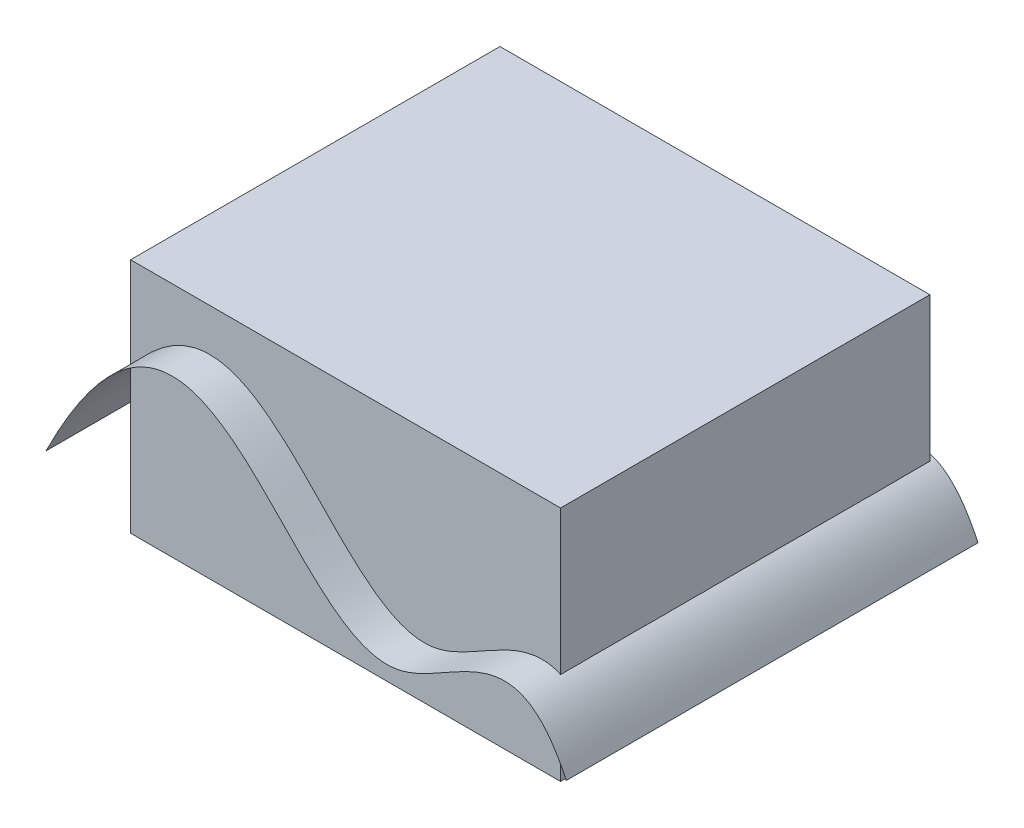
ISO-10303-21;
HEADER;
FILE_DESCRIPTION(('STEP AP214'),'2;1');
FILE_NAME('part.step','',(''),(''),'','','');
FILE_SCHEMA(('AUTOMOTIVE_DESIGN { 1 0 10303 214 1 1 1 1 }'));
ENDSEC;
DATA;
#1=APPLICATION_CONTEXT('core data for automotive mechanical design processes');
#2=APPLICATION_PROTOCOL_DEFINITION('international standard','automotive_design',2000,#1);
#3=PRODUCT_CONTEXT('',#1,'mechanical');
#4=PRODUCT('Part','Part','',(#3));
#5=PRODUCT_RELATED_PRODUCT_CATEGORY('part','',(#4));
#6=PRODUCT_DEFINITION_FORMATION('','',#4);
#7=PRODUCT_DEFINITION_CONTEXT('part definition',#1,'design');
#8=PRODUCT_DEFINITION('design','',#6,#7);
#9=PRODUCT_DEFINITION_SHAPE('','',#8);
#10=(LENGTH_UNIT() NAMED_UNIT(*) SI_UNIT(.MILLI.,.METRE.));
#11=(NAMED_UNIT(*) PLANE_ANGLE_UNIT() SI_UNIT($,.RADIAN.));
#12=(NAMED_UNIT(*) SI_UNIT($,.STERADIAN.) SOLID_ANGLE_UNIT());
#13=UNCERTAINTY_MEASURE_WITH_UNIT(LENGTH_MEASURE(1.E-05),#10,'distance_accuracy_value','');
#14=(GEOMETRIC_REPRESENTATION_CONTEXT(3) GLOBAL_UNCERTAINTY_ASSIGNED_CONTEXT((#13)) GLOBAL_UNIT_ASSIGNED_CONTEXT((#10,
#11,#12)) REPRESENTATION_CONTEXT('',''));
#15=CARTESIAN_POINT('',(0.,0.,0.));
#16=DIRECTION('',(0.,0.,1.));
#17=DIRECTION('',(1.,0.,0.));
#18=AXIS2_PLACEMENT_3D('',#15,#16,#17);
#19=CARTESIAN_POINT('',(-88.9503624856376,22.5454685632026,62.6633162704457));
#20=CARTESIAN_POINT('',(-37.8141386567155,125.215292475116,62.6633162704457));
#21=CARTESIAN_POINT('',(5.84947542840995,-43.7179988687432,62.6633162704457));
#22=CARTESIAN_POINT('',(69.6437169043807,52.4820397279148,62.6633162704457));
#23=CARTESIAN_POINT('',(87.5841174456941,13.9727510125804,62.6633162704457));
#24=B_SPLINE_CURVE_WITH_KNOTS('',3,(#19,#20,#21,#22,#23),.UNSPECIFIED.,.F.,.F.,(4,1,4),(0.,
0.6650166527823,1.),.UNSPECIFIED.);
#25=DIRECTION('',(0.,0.,-1.));
#26=VECTOR('',#25,1.);
#27=SURFACE_OF_LINEAR_EXTRUSION('',#24,#26);
#28=CARTESIAN_POINT('',(-88.9503624856376,22.5454685632026,-64.3366837295543));
#29=CARTESIAN_POINT('',(-37.8141386567155,125.215292475116,-64.3366837295543));
#30=CARTESIAN_POINT('',(5.84947542840995,-43.7179988687432,-64.3366837295543));
#31=CARTESIAN_POINT('',(69.6437169043807,52.4820397279148,-64.3366837295543));
#32=CARTESIAN_POINT('',(87.5841174456941,13.9727510125804,-64.3366837295543));
#33=B_SPLINE_CURVE_WITH_KNOTS('',3,(#28,#29,#30,#31,#32),.UNSPECIFIED.,.F.,.F.,(4,1,4),(0.,
0.6650166527823,1.),.UNSPECIFIED.);
#34=CARTESIAN_POINT('',(-88.9503624856376,22.5454685632026,-64.3366837295543));
#35=VERTEX_POINT('',#34);
#36=CARTESIAN_POINT('',(87.5841174456941,13.9727510125804,-64.3366837295543));
#37=VERTEX_POINT('',#36);
#38=EDGE_CURVE('E55',#35,#37,#33,.T.);
#39=ORIENTED_EDGE('',*,*,#38,.F.);
#40=DIRECTION('',(0.,0.,-1.));
#41=VECTOR('',#40,1.);
#42=CARTESIAN_POINT('',(-88.9503624856376,22.5454685632026,62.6633162704457));
#43=LINE('',#42,#41);
#44=CARTESIAN_POINT('',(-88.9503624856376,22.5454685632026,75.3633162704457));
#45=VERTEX_POINT('',#44);
#46=EDGE_CURVE('E47',#45,#35,#43,.T.);
#47=ORIENTED_EDGE('',*,*,#46,.F.);
#48=CARTESIAN_POINT('',(-88.9503624856376,22.5454685632026,75.3633162704457));
#49=CARTESIAN_POINT('',(-37.8141386567155,125.215292475116,75.3633162704457));
#50=CARTESIAN_POINT('',(5.84947542840995,-43.7179988687432,75.3633162704457));
#51=CARTESIAN_POINT('',(69.6437169043807,52.4820397279148,75.3633162704457));
#52=CARTESIAN_POINT('',(87.5841174456941,13.9727510125804,75.3633162704457));
#53=B_SPLINE_CURVE_WITH_KNOTS('',3,(#48,#49,#50,#51,#52),.UNSPECIFIED.,.F.,.F.,(4,1,4),(0.,
0.6650166527823,1.),.UNSPECIFIED.);
#54=CARTESIAN_POINT('',(87.5841174456941,13.9727510125804,75.3633162704457));
#55=VERTEX_POINT('',#54);
#56=EDGE_CURVE('E65',#45,#55,#53,.T.);
#57=ORIENTED_EDGE('',*,*,#56,.T.);
#58=DIRECTION('',(0.,0.,-1.));
#59=VECTOR('',#58,1.);
#60=CARTESIAN_POINT('',(87.5841174456941,13.9727510125804,62.6633162704457));
#61=LINE('',#60,#59);
#62=EDGE_CURVE('E12',#55,#37,#61,.T.);
#63=ORIENTED_EDGE('',*,*,#62,.T.);
#64=EDGE_LOOP('',(#39,#47,#57,#63));
#65=FACE_BOUND('',#64,.T.);
#66=ADVANCED_FACE('F45',(#65),#27,.T.);
#67=OPEN_SHELL('',(#66));
#68=SHELL_BASED_SURFACE_MODEL('B2',(#67));
#69=CARTESIAN_POINT('',(72.9401001387988,80.3747042919709,62.6633162704457));
#70=DIRECTION('',(-1.,0.,0.));
#71=DIRECTION('',(0.,0.,1.));
#72=AXIS2_PLACEMENT_3D('',#69,#70,#71);
#73=PLANE('',#72);
#74=DIRECTION('',(0.,0.,-1.));
#75=VECTOR('',#74,1.);
#76=CARTESIAN_POINT('',(72.9401001387988,0.,62.6633162704457));
#77=LINE('',#76,#75);
#78=CARTESIAN_POINT('',(72.9401001387988,0.,62.6633162704457));
#79=VERTEX_POINT('',#78);
#80=CARTESIAN_POINT('',(72.9401001387988,0.,-62.6633162704457));
#81=VERTEX_POINT('',#80);
#82=EDGE_CURVE('E169',#79,#81,#77,.T.);
#83=ORIENTED_EDGE('',*,*,#82,.T.);
#84=DIRECTION('',(0.,-1.,0.));
#85=VECTOR('',#84,1.);
#86=CARTESIAN_POINT('',(72.9401001387988,80.3747042919709,-62.6633162704457));
#87=LINE('',#86,#85);
#88=CARTESIAN_POINT('',(72.9401001387988,80.3747042919709,-62.6633162704457));
#89=VERTEX_POINT('',#88);
#90=EDGE_CURVE('E43',#89,#81,#87,.T.);
#91=ORIENTED_EDGE('',*,*,#90,.F.);
#92=DIRECTION('',(0.,0.,-1.));
#93=VECTOR('',#92,1.);
#94=CARTESIAN_POINT('',(72.9401001387988,80.3747042919709,62.6633162704457));
#95=LINE('',#94,#93);
#96=CARTESIAN_POINT('',(72.9401001387988,80.3747042919709,62.6633162704457));
#97=VERTEX_POINT('',#96);
#98=EDGE_CURVE('E157',#97,#89,#95,.T.);
#99=ORIENTED_EDGE('',*,*,#98,.F.);
#100=DIRECTION('',(0.,-1.,0.));
#101=VECTOR('',#100,1.);
#102=CARTESIAN_POINT('',(72.9401001387988,80.3747042919709,62.6633162704457));
#103=LINE('',#102,#101);
#104=EDGE_CURVE('E165',#97,#79,#103,.T.);
#105=ORIENTED_EDGE('',*,*,#104,.T.);
#106=EDGE_LOOP('',(#83,#91,#99,#105));
#107=FACE_BOUND('',#106,.T.);
#108=ADVANCED_FACE('F106',(#107),#73,.F.);
#109=CARTESIAN_POINT('',(-72.9401001387988,80.3747042919709,-62.6633162704457));
#110=DIRECTION('',(0.,0.,1.));
#111=DIRECTION('',(1.,0.,0.));
#112=AXIS2_PLACEMENT_3D('',#109,#110,#111);
#113=PLANE('',#112);
#114=DIRECTION('',(-1.,0.,0.));
#115=VECTOR('',#114,1.);
#116=CARTESIAN_POINT('',(-72.9401001387988,0.,-62.6633162704457));
#117=LINE('',#116,#115);
#118=CARTESIAN_POINT('',(-72.9401001387988,0.,-62.6633162704457));
#119=VERTEX_POINT('',#118);
#120=EDGE_CURVE('E161',#81,#119,#117,.T.);
#121=ORIENTED_EDGE('',*,*,#120,.T.);
#122=DIRECTION('',(0.,-1.,0.));
#123=VECTOR('',#122,1.);
#124=CARTESIAN_POINT('',(-72.9401001387988,80.3747042919709,-62.6633162704457));
#125=LINE('',#124,#123);
#126=CARTESIAN_POINT('',(-72.9401001387988,80.3747042919709,-62.6633162704457));
#127=VERTEX_POINT('',#126);
#128=EDGE_CURVE('E114',#127,#119,#125,.T.);
#129=ORIENTED_EDGE('',*,*,#128,.F.);
#130=DIRECTION('',(-1.,0.,0.));
#131=VECTOR('',#130,1.);
#132=CARTESIAN_POINT('',(-72.9401001387988,80.3747042919709,-62.6633162704457));
#133=LINE('',#132,#131);
#134=EDGE_CURVE('E152',#89,#127,#133,.T.);
#135=ORIENTED_EDGE('',*,*,#134,.F.);
#136=ORIENTED_EDGE('',*,*,#90,.T.);
#137=EDGE_LOOP('',(#121,#129,#135,#136));
#138=FACE_BOUND('',#137,.T.);
#139=ADVANCED_FACE('F160',(#138),#113,.F.);
#140=CARTESIAN_POINT('',(-72.9401001387988,80.3747042919709,62.6633162704457));
#141=DIRECTION('',(1.,0.,0.));
#142=DIRECTION('',(0.,0.,-1.));
#143=AXIS2_PLACEMENT_3D('',#140,#141,#142);
#144=PLANE('',#143);
#145=DIRECTION('',(0.,0.,1.));
#146=VECTOR('',#145,1.);
#147=CARTESIAN_POINT('',(-72.9401001387988,0.,62.6633162704457));
#148=LINE('',#147,#146);
#149=CARTESIAN_POINT('',(-72.9401001387988,0.,62.6633162704457));
#150=VERTEX_POINT('',#149);
#151=EDGE_CURVE('E139',#119,#150,#148,.T.);
#152=ORIENTED_EDGE('',*,*,#151,.T.);
#153=DIRECTION('',(0.,-1.,0.));
#154=VECTOR('',#153,1.);
#155=CARTESIAN_POINT('',(-72.9401001387988,80.3747042919709,62.6633162704457));
#156=LINE('',#155,#154);
#157=CARTESIAN_POINT('',(-72.9401001387988,80.3747042919709,62.6633162704457));
#158=VERTEX_POINT('',#157);
#159=EDGE_CURVE('E162',#158,#150,#156,.T.);
#160=ORIENTED_EDGE('',*,*,#159,.F.);
#161=DIRECTION('',(0.,0.,1.));
#162=VECTOR('',#161,1.);
#163=CARTESIAN_POINT('',(-72.9401001387988,80.3747042919709,62.6633162704457));
#164=LINE('',#163,#162);
#165=EDGE_CURVE('E155',#127,#158,#164,.T.);
#166=ORIENTED_EDGE('',*,*,#165,.F.);
#167=ORIENTED_EDGE('',*,*,#128,.T.);
#168=EDGE_LOOP('',(#152,#160,#166,#167));
#169=FACE_BOUND('',#168,.T.);
#170=ADVANCED_FACE('F163',(#169),#144,.F.);
#171=CARTESIAN_POINT('',(-72.9401001387988,80.3747042919709,62.6633162704457));
#172=DIRECTION('',(0.,0.,-1.));
#173=DIRECTION('',(-1.,0.,0.));
#174=AXIS2_PLACEMENT_3D('',#171,#172,#173);
#175=PLANE('',#174);
#176=DIRECTION('',(1.,0.,0.));
#177=VECTOR('',#176,1.);
#178=CARTESIAN_POINT('',(-72.9401001387988,0.,62.6633162704457));
#179=LINE('',#178,#177);
#180=EDGE_CURVE('E145',#150,#79,#179,.T.);
#181=ORIENTED_EDGE('',*,*,#180,.T.);
#182=ORIENTED_EDGE('',*,*,#104,.F.);
#183=DIRECTION('',(1.,0.,0.));
#184=VECTOR('',#183,1.);
#185=CARTESIAN_POINT('',(-72.9401001387988,80.3747042919709,62.6633162704457));
#186=LINE('',#185,#184);
#187=EDGE_CURVE('E122',#158,#97,#186,.T.);
#188=ORIENTED_EDGE('',*,*,#187,.F.);
#189=ORIENTED_EDGE('',*,*,#159,.T.);
#190=EDGE_LOOP('',(#181,#182,#188,#189));
#191=FACE_BOUND('',#190,.T.);
#192=ADVANCED_FACE('F176',(#191),#175,.F.);
#193=CARTESIAN_POINT('',(0.,80.3747042919709,0.));
#194=DIRECTION('',(0.,-1.,0.));
#195=DIRECTION('',(0.,0.,-1.));
#196=AXIS2_PLACEMENT_3D('',#193,#194,#195);
#197=PLANE('',#196);
#198=ORIENTED_EDGE('',*,*,#98,.T.);
#199=ORIENTED_EDGE('',*,*,#134,.T.);
#200=ORIENTED_EDGE('',*,*,#165,.T.);
#201=ORIENTED_EDGE('',*,*,#187,.T.);
#202=EDGE_LOOP('',(#198,#199,#200,#201));
#203=FACE_BOUND('',#202,.T.);
#204=ADVANCED_FACE('F153',(#203),#197,.F.);
#205=CARTESIAN_POINT('',(0.,0.,0.));
#206=DIRECTION('',(0.,-1.,0.));
#207=DIRECTION('',(0.,0.,-1.));
#208=AXIS2_PLACEMENT_3D('',#205,#206,#207);
#209=PLANE('',#208);
#210=ORIENTED_EDGE('',*,*,#82,.F.);
#211=ORIENTED_EDGE('',*,*,#180,.F.);
#212=ORIENTED_EDGE('',*,*,#151,.F.);
#213=ORIENTED_EDGE('',*,*,#120,.F.);
#214=EDGE_LOOP('',(#210,#211,#212,#213));
#215=FACE_BOUND('',#214,.T.);
#216=ADVANCED_FACE('F179',(#215),#209,.T.);
#217=CLOSED_SHELL('',(#108,#139,#170,#192,#204,#216));
#218=MANIFOLD_SOLID_BREP('B6',#217);
#219=ADVANCED_BREP_SHAPE_REPRESENTATION('',(#18,#218),#14);
#220=MANIFOLD_SURFACE_SHAPE_REPRESENTATION('',(#18,#68),#14);
#221=SHAPE_REPRESENTATION('',(#18),#14);
#222=SHAPE_DEFINITION_REPRESENTATION(#9,#221);
#223=SHAPE_REPRESENTATION_RELATIONSHIP('','',#221,#219);
#224=SHAPE_REPRESENTATION_RELATIONSHIP('','',#221,#220);
ENDSEC;
END-ISO-10303-21;
